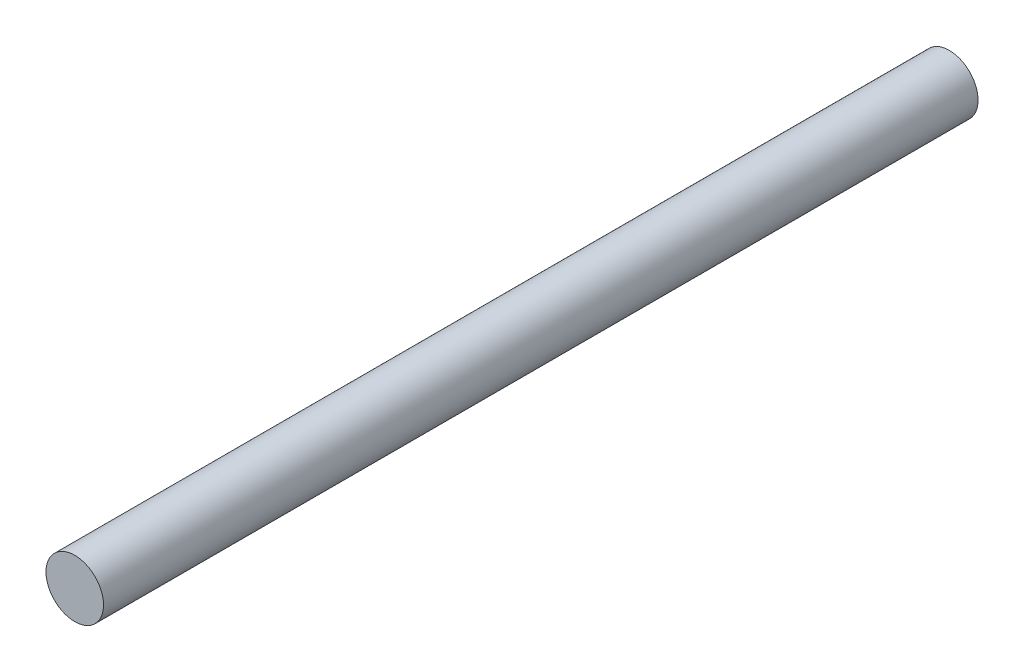
ISO-10303-21;
HEADER;
FILE_DESCRIPTION(('STEP AP214'),'2;1');
FILE_NAME('part.step','',(''),(''),'','','');
FILE_SCHEMA(('AUTOMOTIVE_DESIGN { 1 0 10303 214 1 1 1 1 }'));
ENDSEC;
DATA;
#1=APPLICATION_CONTEXT('core data for automotive mechanical design processes');
#2=APPLICATION_PROTOCOL_DEFINITION('international standard','automotive_design',2000,#1);
#3=PRODUCT_CONTEXT('',#1,'mechanical');
#4=PRODUCT('Part','Part','',(#3));
#5=PRODUCT_RELATED_PRODUCT_CATEGORY('part','',(#4));
#6=PRODUCT_DEFINITION_FORMATION('','',#4);
#7=PRODUCT_DEFINITION_CONTEXT('part definition',#1,'design');
#8=PRODUCT_DEFINITION('design','',#6,#7);
#9=PRODUCT_DEFINITION_SHAPE('','',#8);
#10=(LENGTH_UNIT() NAMED_UNIT(*) SI_UNIT(.MILLI.,.METRE.));
#11=(NAMED_UNIT(*) PLANE_ANGLE_UNIT() SI_UNIT($,.RADIAN.));
#12=(NAMED_UNIT(*) SI_UNIT($,.STERADIAN.) SOLID_ANGLE_UNIT());
#13=UNCERTAINTY_MEASURE_WITH_UNIT(LENGTH_MEASURE(1.E-05),#10,'distance_accuracy_value','');
#14=(GEOMETRIC_REPRESENTATION_CONTEXT(3) GLOBAL_UNCERTAINTY_ASSIGNED_CONTEXT((#13)) GLOBAL_UNIT_ASSIGNED_CONTEXT((#10,
#11,#12)) REPRESENTATION_CONTEXT('',''));
#15=CARTESIAN_POINT('',(0.,0.,0.));
#16=DIRECTION('',(0.,0.,1.));
#17=DIRECTION('',(1.,0.,0.));
#18=AXIS2_PLACEMENT_3D('',#15,#16,#17);
#19=CARTESIAN_POINT('',(0.,0.,48.26));
#20=DIRECTION('',(0.,0.,-1.));
#21=DIRECTION('',(-1.,0.,0.));
#22=AXIS2_PLACEMENT_3D('',#19,#20,#21);
#23=CYLINDRICAL_SURFACE('',#22,1.5875);
#24=CARTESIAN_POINT('',(0.,0.,48.26));
#25=DIRECTION('',(0.,0.,1.));
#26=DIRECTION('',(1.,0.,0.));
#27=AXIS2_PLACEMENT_3D('',#24,#25,#26);
#28=CIRCLE('',#27,1.5875);
#29=CARTESIAN_POINT('',(-1.5875,0.,48.26));
#30=VERTEX_POINT('',#29);
#31=EDGE_CURVE('E10',#30,#30,#28,.T.);
#32=CARTESIAN_POINT('',(0.,0.,0.));
#33=DIRECTION('',(0.,0.,1.));
#34=DIRECTION('',(1.,0.,0.));
#35=AXIS2_PLACEMENT_3D('',#32,#33,#34);
#36=CIRCLE('',#35,1.5875);
#37=CARTESIAN_POINT('',(-1.5875,0.,0.));
#38=VERTEX_POINT('',#37);
#39=EDGE_CURVE('E34',#38,#38,#36,.T.);
#40=CARTESIAN_POINT('',(-1.5875,0.,48.26));
#41=CARTESIAN_POINT('',(-1.5875,0.,47.7572916666667));
#42=CARTESIAN_POINT('',(-1.5875,0.,47.2545833333333));
#43=CARTESIAN_POINT('',(-1.5875,0.,46.2491666666667));
#44=CARTESIAN_POINT('',(-1.5875,0.,45.7464583333333));
#45=CARTESIAN_POINT('',(-1.5875,0.,44.7410416666667));
#46=CARTESIAN_POINT('',(-1.5875,0.,44.2383333333333));
#47=CARTESIAN_POINT('',(-1.5875,0.,43.2329166666667));
#48=CARTESIAN_POINT('',(-1.5875,0.,42.7302083333333));
#49=CARTESIAN_POINT('',(-1.5875,0.,41.7247916666667));
#50=CARTESIAN_POINT('',(-1.5875,0.,41.2220833333333));
#51=CARTESIAN_POINT('',(-1.5875,0.,40.2166666666667));
#52=CARTESIAN_POINT('',(-1.5875,0.,39.7139583333333));
#53=CARTESIAN_POINT('',(-1.5875,0.,38.7085416666667));
#54=CARTESIAN_POINT('',(-1.5875,0.,38.2058333333333));
#55=CARTESIAN_POINT('',(-1.5875,0.,37.2004166666667));
#56=CARTESIAN_POINT('',(-1.5875,0.,36.6977083333333));
#57=CARTESIAN_POINT('',(-1.5875,0.,35.6922916666667));
#58=CARTESIAN_POINT('',(-1.5875,0.,35.1895833333333));
#59=CARTESIAN_POINT('',(-1.5875,0.,34.1841666666667));
#60=CARTESIAN_POINT('',(-1.5875,0.,33.6814583333333));
#61=CARTESIAN_POINT('',(-1.5875,0.,32.6760416666667));
#62=CARTESIAN_POINT('',(-1.5875,0.,32.1733333333333));
#63=CARTESIAN_POINT('',(-1.5875,0.,31.1679166666667));
#64=CARTESIAN_POINT('',(-1.5875,0.,30.6652083333333));
#65=CARTESIAN_POINT('',(-1.5875,0.,29.6597916666667));
#66=CARTESIAN_POINT('',(-1.5875,0.,29.1570833333333));
#67=CARTESIAN_POINT('',(-1.5875,0.,28.1516666666667));
#68=CARTESIAN_POINT('',(-1.5875,0.,27.6489583333333));
#69=CARTESIAN_POINT('',(-1.5875,0.,26.6435416666667));
#70=CARTESIAN_POINT('',(-1.5875,0.,26.1408333333333));
#71=CARTESIAN_POINT('',(-1.5875,0.,25.1354166666667));
#72=CARTESIAN_POINT('',(-1.5875,0.,24.6327083333333));
#73=CARTESIAN_POINT('',(-1.5875,0.,23.6272916666667));
#74=CARTESIAN_POINT('',(-1.5875,0.,23.1245833333333));
#75=CARTESIAN_POINT('',(-1.5875,0.,22.1191666666667));
#76=CARTESIAN_POINT('',(-1.5875,0.,21.6164583333333));
#77=CARTESIAN_POINT('',(-1.5875,0.,20.6110416666667));
#78=CARTESIAN_POINT('',(-1.5875,0.,20.1083333333333));
#79=CARTESIAN_POINT('',(-1.5875,0.,19.1029166666667));
#80=CARTESIAN_POINT('',(-1.5875,0.,18.6002083333333));
#81=CARTESIAN_POINT('',(-1.5875,0.,17.5947916666667));
#82=CARTESIAN_POINT('',(-1.5875,0.,17.0920833333333));
#83=CARTESIAN_POINT('',(-1.5875,0.,16.0866666666667));
#84=CARTESIAN_POINT('',(-1.5875,0.,15.5839583333333));
#85=CARTESIAN_POINT('',(-1.5875,0.,14.5785416666667));
#86=CARTESIAN_POINT('',(-1.5875,0.,14.0758333333333));
#87=CARTESIAN_POINT('',(-1.5875,0.,13.0704166666667));
#88=CARTESIAN_POINT('',(-1.5875,0.,12.5677083333333));
#89=CARTESIAN_POINT('',(-1.5875,0.,11.5622916666667));
#90=CARTESIAN_POINT('',(-1.5875,0.,11.0595833333333));
#91=CARTESIAN_POINT('',(-1.5875,0.,10.0541666666667));
#92=CARTESIAN_POINT('',(-1.5875,0.,9.55145833333333));
#93=CARTESIAN_POINT('',(-1.5875,0.,8.54604166666666));
#94=CARTESIAN_POINT('',(-1.5875,0.,8.04333333333333));
#95=CARTESIAN_POINT('',(-1.5875,0.,7.03791666666666));
#96=CARTESIAN_POINT('',(-1.5875,0.,6.53520833333333));
#97=CARTESIAN_POINT('',(-1.5875,0.,5.52979166666666));
#98=CARTESIAN_POINT('',(-1.5875,0.,5.02708333333333));
#99=CARTESIAN_POINT('',(-1.5875,0.,4.02166666666666));
#100=CARTESIAN_POINT('',(-1.5875,0.,3.51895833333333));
#101=CARTESIAN_POINT('',(-1.5875,0.,2.51354166666666));
#102=CARTESIAN_POINT('',(-1.5875,0.,2.01083333333333));
#103=CARTESIAN_POINT('',(-1.5875,0.,1.00541666666666));
#104=CARTESIAN_POINT('',(-1.5875,0.,0.502708333333326));
#105=CARTESIAN_POINT('',(-1.5875,0.,0.));
#106=B_SPLINE_CURVE_WITH_KNOTS('',3,(#40,#41,#42,#43,#44,#45,#46,#47,#48,#49,#50,#51,#52,#53,
#54,#55,#56,#57,#58,#59,#60,#61,#62,#63,#64,#65,#66,#67,#68,#69,#70,#71,#72,#73,#74,#75,#76,#77,
#78,#79,#80,#81,#82,#83,#84,#85,#86,#87,#88,#89,#90,#91,#92,#93,#94,#95,#96,#97,#98,#99,#100,
#101,#102,#103,#104,#105),.UNSPECIFIED.,.F.,.F.,(4,2,2,2,2,2,2,2,2,2,2,2,2,2,2,2,2,2,2,2,2,2,2,
2,2,2,2,2,2,2,2,2,4),(0.,1.50812500000001,3.01625000000001,4.524375,6.0325,7.540625,9.04875,
10.556875,12.065,13.573125,15.08125,16.589375,18.0975,19.605625,21.11375,22.621875,24.13,
25.638125,27.14625,28.654375,30.1625,31.670625,33.17875,34.686875,36.195,37.703125,39.21125,
40.719375,42.2275,43.735625,45.24375,46.751875,48.26),.UNSPECIFIED.);
#107=EDGE_CURVE('BSEAM31',#30,#38,#106,.T.);
#108=ORIENTED_EDGE('',*,*,#31,.F.);
#109=ORIENTED_EDGE('',*,*,#39,.T.);
#110=ORIENTED_EDGE('',*,*,#107,.T.);
#111=ORIENTED_EDGE('',*,*,#107,.F.);
#112=EDGE_LOOP('',(#108,#110,#109,#111));
#113=FACE_BOUND('',#112,.T.);
#114=ADVANCED_FACE('F31',(#113),#23,.T.);
#115=CARTESIAN_POINT('',(0.,0.,48.26));
#116=DIRECTION('',(0.,0.,1.));
#117=DIRECTION('',(1.,0.,0.));
#118=AXIS2_PLACEMENT_3D('',#115,#116,#117);
#119=PLANE('',#118);
#120=ORIENTED_EDGE('',*,*,#31,.T.);
#121=EDGE_LOOP('',(#120));
#122=FACE_BOUND('',#121,.T.);
#123=ADVANCED_FACE('F46',(#122),#119,.T.);
#124=CARTESIAN_POINT('',(0.,0.,0.));
#125=DIRECTION('',(0.,0.,1.));
#126=DIRECTION('',(1.,0.,0.));
#127=AXIS2_PLACEMENT_3D('',#124,#125,#126);
#128=PLANE('',#127);
#129=ORIENTED_EDGE('',*,*,#39,.F.);
#130=EDGE_LOOP('',(#129));
#131=FACE_BOUND('',#130,.T.);
#132=ADVANCED_FACE('F44',(#131),#128,.F.);
#133=CLOSED_SHELL('',(#114,#123,#132));
#134=MANIFOLD_SOLID_BREP('B2',#133);
#135=ADVANCED_BREP_SHAPE_REPRESENTATION('',(#18,#134),#14);
#136=SHAPE_DEFINITION_REPRESENTATION(#9,#135);
ENDSEC;
END-ISO-10303-21;
